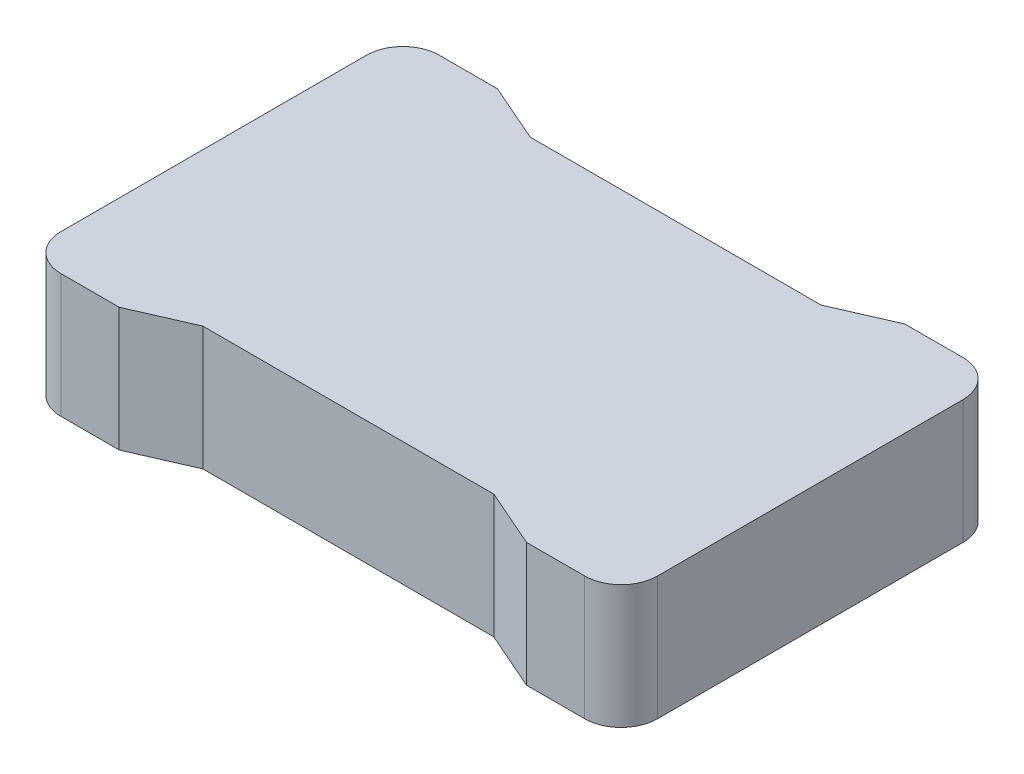
ISO-10303-21;
HEADER;
FILE_DESCRIPTION(('STEP AP214'),'2;1');
FILE_NAME('part.step','',(''),(''),'','','');
FILE_SCHEMA(('AUTOMOTIVE_DESIGN { 1 0 10303 214 1 1 1 1 }'));
ENDSEC;
DATA;
#1=APPLICATION_CONTEXT('core data for automotive mechanical design processes');
#2=APPLICATION_PROTOCOL_DEFINITION('international standard','automotive_design',2000,#1);
#3=PRODUCT_CONTEXT('',#1,'mechanical');
#4=PRODUCT('Part','Part','',(#3));
#5=PRODUCT_RELATED_PRODUCT_CATEGORY('part','',(#4));
#6=PRODUCT_DEFINITION_FORMATION('','',#4);
#7=PRODUCT_DEFINITION_CONTEXT('part definition',#1,'design');
#8=PRODUCT_DEFINITION('design','',#6,#7);
#9=PRODUCT_DEFINITION_SHAPE('','',#8);
#10=(LENGTH_UNIT() NAMED_UNIT(*) SI_UNIT(.MILLI.,.METRE.));
#11=(NAMED_UNIT(*) PLANE_ANGLE_UNIT() SI_UNIT($,.RADIAN.));
#12=(NAMED_UNIT(*) SI_UNIT($,.STERADIAN.) SOLID_ANGLE_UNIT());
#13=UNCERTAINTY_MEASURE_WITH_UNIT(LENGTH_MEASURE(1.E-05),#10,'distance_accuracy_value','');
#14=(GEOMETRIC_REPRESENTATION_CONTEXT(3) GLOBAL_UNCERTAINTY_ASSIGNED_CONTEXT((#13)) GLOBAL_UNIT_ASSIGNED_CONTEXT((#10,
#11,#12)) REPRESENTATION_CONTEXT('',''));
#15=CARTESIAN_POINT('',(0.,0.,0.));
#16=DIRECTION('',(0.,0.,1.));
#17=DIRECTION('',(1.,0.,0.));
#18=AXIS2_PLACEMENT_3D('',#15,#16,#17);
#19=CARTESIAN_POINT('',(20.,17.,-22.5));
#20=DIRECTION('',(0.400818834019709,0.,0.916157334902189));
#21=DIRECTION('',(0.916157334902188,0.,-0.400818834019709));
#22=AXIS2_PLACEMENT_3D('',#19,#20,#21);
#23=PLANE('',#22);
#24=DIRECTION('',(-0.916157334902188,0.,0.400818834019709));
#25=VECTOR('',#24,1.);
#26=CARTESIAN_POINT('',(20.,0.,-22.5));
#27=LINE('',#26,#25);
#28=CARTESIAN_POINT('',(28.,0.,-26.));
#29=VERTEX_POINT('',#28);
#30=CARTESIAN_POINT('',(20.,0.,-22.5));
#31=VERTEX_POINT('',#30);
#32=EDGE_CURVE('E200',#29,#31,#27,.T.);
#33=ORIENTED_EDGE('',*,*,#32,.T.);
#34=DIRECTION('',(0.,-1.,0.));
#35=VECTOR('',#34,1.);
#36=CARTESIAN_POINT('',(20.,17.,-22.5));
#37=LINE('',#36,#35);
#38=CARTESIAN_POINT('',(20.,17.,-22.5));
#39=VERTEX_POINT('',#38);
#40=EDGE_CURVE('E11',#39,#31,#37,.T.);
#41=ORIENTED_EDGE('',*,*,#40,.F.);
#42=DIRECTION('',(-0.916157334902188,0.,0.400818834019709));
#43=VECTOR('',#42,1.);
#44=CARTESIAN_POINT('',(20.,17.,-22.5));
#45=LINE('',#44,#43);
#46=CARTESIAN_POINT('',(28.,17.,-26.));
#47=VERTEX_POINT('',#46);
#48=EDGE_CURVE('E248',#47,#39,#45,.T.);
#49=ORIENTED_EDGE('',*,*,#48,.F.);
#50=DIRECTION('',(0.,-1.,0.));
#51=VECTOR('',#50,1.);
#52=CARTESIAN_POINT('',(28.,17.,-26.));
#53=LINE('',#52,#51);
#54=EDGE_CURVE('E196',#47,#29,#53,.T.);
#55=ORIENTED_EDGE('',*,*,#54,.T.);
#56=EDGE_LOOP('',(#33,#41,#49,#55));
#57=FACE_BOUND('',#56,.T.);
#58=ADVANCED_FACE('F39',(#57),#23,.F.);
#59=CARTESIAN_POINT('',(-20.,17.,-22.5));
#60=DIRECTION('',(0.,0.,1.));
#61=DIRECTION('',(1.,0.,0.));
#62=AXIS2_PLACEMENT_3D('',#59,#60,#61);
#63=PLANE('',#62);
#64=DIRECTION('',(1.,0.,0.));
#65=VECTOR('',#64,1.);
#66=CARTESIAN_POINT('',(-14.85,10.4,-22.5));
#67=LINE('',#66,#65);
#68=CARTESIAN_POINT('',(-14.85,10.4,-22.5));
#69=VERTEX_POINT('',#68);
#70=CARTESIAN_POINT('',(-10.15,10.4,-22.5));
#71=VERTEX_POINT('',#70);
#72=EDGE_CURVE('E389',#69,#71,#67,.T.);
#73=ORIENTED_EDGE('',*,*,#72,.F.);
#74=CARTESIAN_POINT('',(-14.85,8.5,-22.5));
#75=DIRECTION('',(0.,0.,-1.));
#76=DIRECTION('',(-1.,0.,0.));
#77=AXIS2_PLACEMENT_3D('',#74,#75,#76);
#78=CIRCLE('',#77,1.9);
#79=CARTESIAN_POINT('',(-14.85,6.6,-22.5));
#80=VERTEX_POINT('',#79);
#81=EDGE_CURVE('E54',#80,#69,#78,.T.);
#82=ORIENTED_EDGE('',*,*,#81,.F.);
#83=DIRECTION('',(-1.,0.,0.));
#84=VECTOR('',#83,1.);
#85=CARTESIAN_POINT('',(-14.85,6.6,-22.5));
#86=LINE('',#85,#84);
#87=CARTESIAN_POINT('',(-10.15,6.6,-22.5));
#88=VERTEX_POINT('',#87);
#89=EDGE_CURVE('E380',#88,#80,#86,.T.);
#90=ORIENTED_EDGE('',*,*,#89,.F.);
#91=CARTESIAN_POINT('',(-10.15,8.5,-22.5));
#92=DIRECTION('',(0.,0.,-1.));
#93=DIRECTION('',(-1.,0.,0.));
#94=AXIS2_PLACEMENT_3D('',#91,#92,#93);
#95=CIRCLE('',#94,1.9);
#96=EDGE_CURVE('E385',#71,#88,#95,.T.);
#97=ORIENTED_EDGE('',*,*,#96,.F.);
#98=EDGE_LOOP('',(#73,#82,#90,#97));
#99=FACE_BOUND('',#98,.T.);
#100=DIRECTION('',(-1.,0.,0.));
#101=VECTOR('',#100,1.);
#102=CARTESIAN_POINT('',(-20.,0.,-22.5));
#103=LINE('',#102,#101);
#104=CARTESIAN_POINT('',(-20.,0.,-22.5));
#105=VERTEX_POINT('',#104);
#106=EDGE_CURVE('E204',#31,#105,#103,.T.);
#107=ORIENTED_EDGE('',*,*,#106,.T.);
#108=DIRECTION('',(0.,-1.,0.));
#109=VECTOR('',#108,1.);
#110=CARTESIAN_POINT('',(-20.,17.,-22.5));
#111=LINE('',#110,#109);
#112=CARTESIAN_POINT('',(-20.,17.,-22.5));
#113=VERTEX_POINT('',#112);
#114=EDGE_CURVE('E47',#113,#105,#111,.T.);
#115=ORIENTED_EDGE('',*,*,#114,.F.);
#116=DIRECTION('',(-1.,0.,0.));
#117=VECTOR('',#116,1.);
#118=CARTESIAN_POINT('',(-20.,17.,-22.5));
#119=LINE('',#118,#117);
#120=EDGE_CURVE('E128',#39,#113,#119,.T.);
#121=ORIENTED_EDGE('',*,*,#120,.F.);
#122=ORIENTED_EDGE('',*,*,#40,.T.);
#123=EDGE_LOOP('',(#107,#115,#121,#122));
#124=FACE_BOUND('',#123,.T.);
#125=ADVANCED_FACE('F436',(#99,#124),#63,.F.);
#126=CARTESIAN_POINT('',(-28.,17.,-26.));
#127=DIRECTION('',(-0.400818834019709,0.,0.916157334902189));
#128=DIRECTION('',(0.916157334902189,0.,0.400818834019709));
#129=AXIS2_PLACEMENT_3D('',#126,#127,#128);
#130=PLANE('',#129);
#131=DIRECTION('',(-0.916157334902189,0.,-0.400818834019709));
#132=VECTOR('',#131,1.);
#133=CARTESIAN_POINT('',(-28.,0.,-26.));
#134=LINE('',#133,#132);
#135=CARTESIAN_POINT('',(-28.,0.,-26.));
#136=VERTEX_POINT('',#135);
#137=EDGE_CURVE('E208',#105,#136,#134,.T.);
#138=ORIENTED_EDGE('',*,*,#137,.T.);
#139=DIRECTION('',(0.,-1.,0.));
#140=VECTOR('',#139,1.);
#141=CARTESIAN_POINT('',(-28.,17.,-26.));
#142=LINE('',#141,#140);
#143=CARTESIAN_POINT('',(-28.,17.,-26.));
#144=VERTEX_POINT('',#143);
#145=EDGE_CURVE('E291',#144,#136,#142,.T.);
#146=ORIENTED_EDGE('',*,*,#145,.F.);
#147=DIRECTION('',(-0.916157334902189,0.,-0.400818834019709));
#148=VECTOR('',#147,1.);
#149=CARTESIAN_POINT('',(-28.,17.,-26.));
#150=LINE('',#149,#148);
#151=EDGE_CURVE('E301',#113,#144,#150,.T.);
#152=ORIENTED_EDGE('',*,*,#151,.F.);
#153=ORIENTED_EDGE('',*,*,#114,.T.);
#154=EDGE_LOOP('',(#138,#146,#152,#153));
#155=FACE_BOUND('',#154,.T.);
#156=ADVANCED_FACE('F299',(#155),#130,.F.);
#157=CARTESIAN_POINT('',(-36.,17.,-26.));
#158=DIRECTION('',(0.,0.,1.));
#159=DIRECTION('',(1.,0.,0.));
#160=AXIS2_PLACEMENT_3D('',#157,#158,#159);
#161=PLANE('',#160);
#162=DIRECTION('',(-1.,0.,0.));
#163=VECTOR('',#162,1.);
#164=CARTESIAN_POINT('',(-36.,0.,-26.));
#165=LINE('',#164,#163);
#166=CARTESIAN_POINT('',(-36.,0.,-26.));
#167=VERTEX_POINT('',#166);
#168=EDGE_CURVE('E211',#136,#167,#165,.T.);
#169=ORIENTED_EDGE('',*,*,#168,.T.);
#170=DIRECTION('',(0.,-1.,0.));
#171=VECTOR('',#170,1.);
#172=CARTESIAN_POINT('',(-36.,17.,-26.));
#173=LINE('',#172,#171);
#174=CARTESIAN_POINT('',(-36.,17.,-26.));
#175=VERTEX_POINT('',#174);
#176=EDGE_CURVE('E287',#175,#167,#173,.T.);
#177=ORIENTED_EDGE('',*,*,#176,.F.);
#178=DIRECTION('',(-1.,0.,0.));
#179=VECTOR('',#178,1.);
#180=CARTESIAN_POINT('',(-36.,17.,-26.));
#181=LINE('',#180,#179);
#182=EDGE_CURVE('E320',#144,#175,#181,.T.);
#183=ORIENTED_EDGE('',*,*,#182,.F.);
#184=ORIENTED_EDGE('',*,*,#145,.T.);
#185=EDGE_LOOP('',(#169,#177,#183,#184));
#186=FACE_BOUND('',#185,.T.);
#187=ADVANCED_FACE('F310',(#186),#161,.F.);
#188=CARTESIAN_POINT('',(-36.,17.,-21.));
#189=DIRECTION('',(0.,-1.,0.));
#190=DIRECTION('',(0.,0.,-1.));
#191=AXIS2_PLACEMENT_3D('',#188,#189,#190);
#192=CYLINDRICAL_SURFACE('',#191,5.);
#193=CARTESIAN_POINT('',(-36.,0.,-21.));
#194=DIRECTION('',(0.,1.,0.));
#195=DIRECTION('',(0.,0.,-1.));
#196=AXIS2_PLACEMENT_3D('',#193,#194,#195);
#197=CIRCLE('',#196,5.);
#198=CARTESIAN_POINT('',(-41.,0.,-21.));
#199=VERTEX_POINT('',#198);
#200=EDGE_CURVE('E214',#167,#199,#197,.T.);
#201=ORIENTED_EDGE('',*,*,#200,.T.);
#202=DIRECTION('',(0.,-1.,0.));
#203=VECTOR('',#202,1.);
#204=CARTESIAN_POINT('',(-41.,17.,-21.));
#205=LINE('',#204,#203);
#206=CARTESIAN_POINT('',(-41.,17.,-21.));
#207=VERTEX_POINT('',#206);
#208=EDGE_CURVE('E283',#207,#199,#205,.T.);
#209=ORIENTED_EDGE('',*,*,#208,.F.);
#210=CARTESIAN_POINT('',(-36.,17.,-21.));
#211=DIRECTION('',(0.,1.,0.));
#212=DIRECTION('',(0.,0.,-1.));
#213=AXIS2_PLACEMENT_3D('',#210,#211,#212);
#214=CIRCLE('',#213,5.);
#215=EDGE_CURVE('E316',#175,#207,#214,.T.);
#216=ORIENTED_EDGE('',*,*,#215,.F.);
#217=ORIENTED_EDGE('',*,*,#176,.T.);
#218=EDGE_LOOP('',(#201,#209,#216,#217));
#219=FACE_BOUND('',#218,.T.);
#220=ADVANCED_FACE('F314',(#219),#192,.T.);
#221=CARTESIAN_POINT('',(-41.,17.,21.));
#222=DIRECTION('',(1.,0.,0.));
#223=DIRECTION('',(0.,0.,-1.));
#224=AXIS2_PLACEMENT_3D('',#221,#222,#223);
#225=PLANE('',#224);
#226=DIRECTION('',(0.,0.,1.));
#227=VECTOR('',#226,1.);
#228=CARTESIAN_POINT('',(-41.,0.,21.));
#229=LINE('',#228,#227);
#230=CARTESIAN_POINT('',(-41.,0.,21.));
#231=VERTEX_POINT('',#230);
#232=EDGE_CURVE('E217',#199,#231,#229,.T.);
#233=ORIENTED_EDGE('',*,*,#232,.T.);
#234=DIRECTION('',(0.,-1.,0.));
#235=VECTOR('',#234,1.);
#236=CARTESIAN_POINT('',(-41.,17.,21.));
#237=LINE('',#236,#235);
#238=CARTESIAN_POINT('',(-41.,17.,21.));
#239=VERTEX_POINT('',#238);
#240=EDGE_CURVE('E279',#239,#231,#237,.T.);
#241=ORIENTED_EDGE('',*,*,#240,.F.);
#242=DIRECTION('',(0.,0.,1.));
#243=VECTOR('',#242,1.);
#244=CARTESIAN_POINT('',(-41.,17.,21.));
#245=LINE('',#244,#243);
#246=EDGE_CURVE('E319',#207,#239,#245,.T.);
#247=ORIENTED_EDGE('',*,*,#246,.F.);
#248=ORIENTED_EDGE('',*,*,#208,.T.);
#249=EDGE_LOOP('',(#233,#241,#247,#248));
#250=FACE_BOUND('',#249,.T.);
#251=ADVANCED_FACE('F461',(#250),#225,.F.);
#252=CARTESIAN_POINT('',(-36.,17.,21.));
#253=DIRECTION('',(0.,-1.,0.));
#254=DIRECTION('',(0.,0.,-1.));
#255=AXIS2_PLACEMENT_3D('',#252,#253,#254);
#256=CYLINDRICAL_SURFACE('',#255,5.);
#257=CARTESIAN_POINT('',(-36.,0.,21.));
#258=DIRECTION('',(0.,1.,0.));
#259=DIRECTION('',(0.,0.,-1.));
#260=AXIS2_PLACEMENT_3D('',#257,#258,#259);
#261=CIRCLE('',#260,5.);
#262=CARTESIAN_POINT('',(-36.,0.,26.));
#263=VERTEX_POINT('',#262);
#264=EDGE_CURVE('E220',#231,#263,#261,.T.);
#265=ORIENTED_EDGE('',*,*,#264,.T.);
#266=DIRECTION('',(0.,-1.,0.));
#267=VECTOR('',#266,1.);
#268=CARTESIAN_POINT('',(-36.,17.,26.));
#269=LINE('',#268,#267);
#270=CARTESIAN_POINT('',(-36.,17.,26.));
#271=VERTEX_POINT('',#270);
#272=EDGE_CURVE('E275',#271,#263,#269,.T.);
#273=ORIENTED_EDGE('',*,*,#272,.F.);
#274=CARTESIAN_POINT('',(-36.,17.,21.));
#275=DIRECTION('',(0.,1.,0.));
#276=DIRECTION('',(0.,0.,-1.));
#277=AXIS2_PLACEMENT_3D('',#274,#275,#276);
#278=CIRCLE('',#277,5.);
#279=EDGE_CURVE('E324',#239,#271,#278,.T.);
#280=ORIENTED_EDGE('',*,*,#279,.F.);
#281=ORIENTED_EDGE('',*,*,#240,.T.);
#282=EDGE_LOOP('',(#265,#273,#280,#281));
#283=FACE_BOUND('',#282,.T.);
#284=ADVANCED_FACE('F464',(#283),#256,.T.);
#285=CARTESIAN_POINT('',(-36.,17.,26.));
#286=DIRECTION('',(0.,0.,-1.));
#287=DIRECTION('',(-1.,0.,0.));
#288=AXIS2_PLACEMENT_3D('',#285,#286,#287);
#289=PLANE('',#288);
#290=DIRECTION('',(1.,0.,0.));
#291=VECTOR('',#290,1.);
#292=CARTESIAN_POINT('',(-36.,0.,26.));
#293=LINE('',#292,#291);
#294=CARTESIAN_POINT('',(-28.,0.,26.));
#295=VERTEX_POINT('',#294);
#296=EDGE_CURVE('E223',#263,#295,#293,.T.);
#297=ORIENTED_EDGE('',*,*,#296,.T.);
#298=DIRECTION('',(0.,-1.,0.));
#299=VECTOR('',#298,1.);
#300=CARTESIAN_POINT('',(-28.,17.,26.));
#301=LINE('',#300,#299);
#302=CARTESIAN_POINT('',(-28.,17.,26.));
#303=VERTEX_POINT('',#302);
#304=EDGE_CURVE('E271',#303,#295,#301,.T.);
#305=ORIENTED_EDGE('',*,*,#304,.F.);
#306=DIRECTION('',(1.,0.,0.));
#307=VECTOR('',#306,1.);
#308=CARTESIAN_POINT('',(-36.,17.,26.));
#309=LINE('',#308,#307);
#310=EDGE_CURVE('E331',#271,#303,#309,.T.);
#311=ORIENTED_EDGE('',*,*,#310,.F.);
#312=ORIENTED_EDGE('',*,*,#272,.T.);
#313=EDGE_LOOP('',(#297,#305,#311,#312));
#314=FACE_BOUND('',#313,.T.);
#315=ADVANCED_FACE('F468',(#314),#289,.F.);
#316=CARTESIAN_POINT('',(-20.,17.,22.5));
#317=DIRECTION('',(-0.400818834019706,0.,-0.91615733490219));
#318=DIRECTION('',(-0.91615733490219,0.,0.400818834019706));
#319=AXIS2_PLACEMENT_3D('',#316,#317,#318);
#320=PLANE('',#319);
#321=DIRECTION('',(0.91615733490219,0.,-0.400818834019706));
#322=VECTOR('',#321,1.);
#323=CARTESIAN_POINT('',(-20.,0.,22.5));
#324=LINE('',#323,#322);
#325=CARTESIAN_POINT('',(-20.,0.,22.5));
#326=VERTEX_POINT('',#325);
#327=EDGE_CURVE('E226',#295,#326,#324,.T.);
#328=ORIENTED_EDGE('',*,*,#327,.T.);
#329=DIRECTION('',(0.,-1.,0.));
#330=VECTOR('',#329,1.);
#331=CARTESIAN_POINT('',(-20.,17.,22.5));
#332=LINE('',#331,#330);
#333=CARTESIAN_POINT('',(-20.,17.,22.5));
#334=VERTEX_POINT('',#333);
#335=EDGE_CURVE('E267',#334,#326,#332,.T.);
#336=ORIENTED_EDGE('',*,*,#335,.F.);
#337=DIRECTION('',(0.91615733490219,0.,-0.400818834019706));
#338=VECTOR('',#337,1.);
#339=CARTESIAN_POINT('',(-20.,17.,22.5));
#340=LINE('',#339,#338);
#341=EDGE_CURVE('E334',#303,#334,#340,.T.);
#342=ORIENTED_EDGE('',*,*,#341,.F.);
#343=ORIENTED_EDGE('',*,*,#304,.T.);
#344=EDGE_LOOP('',(#328,#336,#342,#343));
#345=FACE_BOUND('',#344,.T.);
#346=ADVANCED_FACE('F472',(#345),#320,.F.);
#347=CARTESIAN_POINT('',(-20.,17.,22.5));
#348=DIRECTION('',(0.,0.,-1.));
#349=DIRECTION('',(-1.,0.,0.));
#350=AXIS2_PLACEMENT_3D('',#347,#348,#349);
#351=PLANE('',#350);
#352=DIRECTION('',(1.,0.,0.));
#353=VECTOR('',#352,1.);
#354=CARTESIAN_POINT('',(-20.,0.,22.5));
#355=LINE('',#354,#353);
#356=CARTESIAN_POINT('',(20.,0.,22.5));
#357=VERTEX_POINT('',#356);
#358=EDGE_CURVE('E229',#326,#357,#355,.T.);
#359=ORIENTED_EDGE('',*,*,#358,.T.);
#360=DIRECTION('',(0.,-1.,0.));
#361=VECTOR('',#360,1.);
#362=CARTESIAN_POINT('',(20.,17.,22.5));
#363=LINE('',#362,#361);
#364=CARTESIAN_POINT('',(20.,17.,22.5));
#365=VERTEX_POINT('',#364);
#366=EDGE_CURVE('E263',#365,#357,#363,.T.);
#367=ORIENTED_EDGE('',*,*,#366,.F.);
#368=DIRECTION('',(1.,0.,0.));
#369=VECTOR('',#368,1.);
#370=CARTESIAN_POINT('',(-20.,17.,22.5));
#371=LINE('',#370,#369);
#372=EDGE_CURVE('E337',#334,#365,#371,.T.);
#373=ORIENTED_EDGE('',*,*,#372,.F.);
#374=ORIENTED_EDGE('',*,*,#335,.T.);
#375=EDGE_LOOP('',(#359,#367,#373,#374));
#376=FACE_BOUND('',#375,.T.);
#377=ADVANCED_FACE('F476',(#376),#351,.F.);
#378=CARTESIAN_POINT('',(28.,17.,26.));
#379=DIRECTION('',(0.400818834019706,0.,-0.91615733490219));
#380=DIRECTION('',(-0.91615733490219,0.,-0.400818834019706));
#381=AXIS2_PLACEMENT_3D('',#378,#379,#380);
#382=PLANE('',#381);
#383=DIRECTION('',(0.91615733490219,0.,0.400818834019706));
#384=VECTOR('',#383,1.);
#385=CARTESIAN_POINT('',(28.,0.,26.));
#386=LINE('',#385,#384);
#387=CARTESIAN_POINT('',(28.,0.,26.));
#388=VERTEX_POINT('',#387);
#389=EDGE_CURVE('E232',#357,#388,#386,.T.);
#390=ORIENTED_EDGE('',*,*,#389,.T.);
#391=DIRECTION('',(0.,-1.,0.));
#392=VECTOR('',#391,1.);
#393=CARTESIAN_POINT('',(28.,17.,26.));
#394=LINE('',#393,#392);
#395=CARTESIAN_POINT('',(28.,17.,26.));
#396=VERTEX_POINT('',#395);
#397=EDGE_CURVE('E259',#396,#388,#394,.T.);
#398=ORIENTED_EDGE('',*,*,#397,.F.);
#399=DIRECTION('',(0.91615733490219,0.,0.400818834019706));
#400=VECTOR('',#399,1.);
#401=CARTESIAN_POINT('',(28.,17.,26.));
#402=LINE('',#401,#400);
#403=EDGE_CURVE('E340',#365,#396,#402,.T.);
#404=ORIENTED_EDGE('',*,*,#403,.F.);
#405=ORIENTED_EDGE('',*,*,#366,.T.);
#406=EDGE_LOOP('',(#390,#398,#404,#405));
#407=FACE_BOUND('',#406,.T.);
#408=ADVANCED_FACE('F480',(#407),#382,.F.);
#409=CARTESIAN_POINT('',(28.,17.,26.));
#410=DIRECTION('',(0.,0.,-1.));
#411=DIRECTION('',(-1.,0.,0.));
#412=AXIS2_PLACEMENT_3D('',#409,#410,#411);
#413=PLANE('',#412);
#414=DIRECTION('',(1.,0.,0.));
#415=VECTOR('',#414,1.);
#416=CARTESIAN_POINT('',(28.,0.,26.));
#417=LINE('',#416,#415);
#418=CARTESIAN_POINT('',(36.,0.,26.));
#419=VERTEX_POINT('',#418);
#420=EDGE_CURVE('E235',#388,#419,#417,.T.);
#421=ORIENTED_EDGE('',*,*,#420,.T.);
#422=DIRECTION('',(0.,-1.,0.));
#423=VECTOR('',#422,1.);
#424=CARTESIAN_POINT('',(36.,17.,26.));
#425=LINE('',#424,#423);
#426=CARTESIAN_POINT('',(36.,17.,26.));
#427=VERTEX_POINT('',#426);
#428=EDGE_CURVE('E255',#427,#419,#425,.T.);
#429=ORIENTED_EDGE('',*,*,#428,.F.);
#430=DIRECTION('',(1.,0.,0.));
#431=VECTOR('',#430,1.);
#432=CARTESIAN_POINT('',(28.,17.,26.));
#433=LINE('',#432,#431);
#434=EDGE_CURVE('E343',#396,#427,#433,.T.);
#435=ORIENTED_EDGE('',*,*,#434,.F.);
#436=ORIENTED_EDGE('',*,*,#397,.T.);
#437=EDGE_LOOP('',(#421,#429,#435,#436));
#438=FACE_BOUND('',#437,.T.);
#439=ADVANCED_FACE('F351',(#438),#413,.F.);
#440=CARTESIAN_POINT('',(36.,17.,21.));
#441=DIRECTION('',(0.,-1.,0.));
#442=DIRECTION('',(0.,0.,-1.));
#443=AXIS2_PLACEMENT_3D('',#440,#441,#442);
#444=CYLINDRICAL_SURFACE('',#443,5.);
#445=CARTESIAN_POINT('',(36.,0.,21.));
#446=DIRECTION('',(0.,1.,0.));
#447=DIRECTION('',(0.,0.,1.));
#448=AXIS2_PLACEMENT_3D('',#445,#446,#447);
#449=CIRCLE('',#448,5.);
#450=CARTESIAN_POINT('',(41.,0.,21.));
#451=VERTEX_POINT('',#450);
#452=EDGE_CURVE('E238',#419,#451,#449,.T.);
#453=ORIENTED_EDGE('',*,*,#452,.T.);
#454=DIRECTION('',(0.,-1.,0.));
#455=VECTOR('',#454,1.);
#456=CARTESIAN_POINT('',(41.,17.,21.));
#457=LINE('',#456,#455);
#458=CARTESIAN_POINT('',(41.,17.,21.));
#459=VERTEX_POINT('',#458);
#460=EDGE_CURVE('E189',#459,#451,#457,.T.);
#461=ORIENTED_EDGE('',*,*,#460,.F.);
#462=CARTESIAN_POINT('',(36.,17.,21.));
#463=DIRECTION('',(0.,1.,0.));
#464=DIRECTION('',(0.,0.,1.));
#465=AXIS2_PLACEMENT_3D('',#462,#463,#464);
#466=CIRCLE('',#465,5.);
#467=EDGE_CURVE('E175',#427,#459,#466,.T.);
#468=ORIENTED_EDGE('',*,*,#467,.F.);
#469=ORIENTED_EDGE('',*,*,#428,.T.);
#470=EDGE_LOOP('',(#453,#461,#468,#469));
#471=FACE_BOUND('',#470,.T.);
#472=ADVANCED_FACE('F355',(#471),#444,.T.);
#473=CARTESIAN_POINT('',(41.,17.,21.));
#474=DIRECTION('',(-1.,0.,0.));
#475=DIRECTION('',(0.,0.,1.));
#476=AXIS2_PLACEMENT_3D('',#473,#474,#475);
#477=PLANE('',#476);
#478=DIRECTION('',(0.,0.,-1.));
#479=VECTOR('',#478,1.);
#480=CARTESIAN_POINT('',(41.,0.,21.));
#481=LINE('',#480,#479);
#482=CARTESIAN_POINT('',(41.,0.,-21.));
#483=VERTEX_POINT('',#482);
#484=EDGE_CURVE('E185',#451,#483,#481,.T.);
#485=ORIENTED_EDGE('',*,*,#484,.T.);
#486=DIRECTION('',(0.,-1.,0.));
#487=VECTOR('',#486,1.);
#488=CARTESIAN_POINT('',(41.,17.,-21.));
#489=LINE('',#488,#487);
#490=CARTESIAN_POINT('',(41.,17.,-21.));
#491=VERTEX_POINT('',#490);
#492=EDGE_CURVE('E182',#491,#483,#489,.T.);
#493=ORIENTED_EDGE('',*,*,#492,.F.);
#494=DIRECTION('',(0.,0.,-1.));
#495=VECTOR('',#494,1.);
#496=CARTESIAN_POINT('',(41.,17.,21.));
#497=LINE('',#496,#495);
#498=EDGE_CURVE('E168',#459,#491,#497,.T.);
#499=ORIENTED_EDGE('',*,*,#498,.F.);
#500=ORIENTED_EDGE('',*,*,#460,.T.);
#501=EDGE_LOOP('',(#485,#493,#499,#500));
#502=FACE_BOUND('',#501,.T.);
#503=ADVANCED_FACE('F183',(#502),#477,.F.);
#504=CARTESIAN_POINT('',(36.,17.,-21.));
#505=DIRECTION('',(0.,-1.,0.));
#506=DIRECTION('',(0.,0.,-1.));
#507=AXIS2_PLACEMENT_3D('',#504,#505,#506);
#508=CYLINDRICAL_SURFACE('',#507,5.);
#509=CARTESIAN_POINT('',(36.,0.,-21.));
#510=DIRECTION('',(0.,1.,0.));
#511=DIRECTION('',(0.,0.,-1.));
#512=AXIS2_PLACEMENT_3D('',#509,#510,#511);
#513=CIRCLE('',#512,5.);
#514=CARTESIAN_POINT('',(36.,0.,-26.));
#515=VERTEX_POINT('',#514);
#516=EDGE_CURVE('E243',#483,#515,#513,.T.);
#517=ORIENTED_EDGE('',*,*,#516,.T.);
#518=DIRECTION('',(0.,-1.,0.));
#519=VECTOR('',#518,1.);
#520=CARTESIAN_POINT('',(36.,17.,-26.));
#521=LINE('',#520,#519);
#522=CARTESIAN_POINT('',(36.,17.,-26.));
#523=VERTEX_POINT('',#522);
#524=EDGE_CURVE('E190',#523,#515,#521,.T.);
#525=ORIENTED_EDGE('',*,*,#524,.F.);
#526=CARTESIAN_POINT('',(36.,17.,-21.));
#527=DIRECTION('',(0.,1.,0.));
#528=DIRECTION('',(0.,0.,-1.));
#529=AXIS2_PLACEMENT_3D('',#526,#527,#528);
#530=CIRCLE('',#529,5.);
#531=EDGE_CURVE('E172',#491,#523,#530,.T.);
#532=ORIENTED_EDGE('',*,*,#531,.F.);
#533=ORIENTED_EDGE('',*,*,#492,.T.);
#534=EDGE_LOOP('',(#517,#525,#532,#533));
#535=FACE_BOUND('',#534,.T.);
#536=ADVANCED_FACE('F192',(#535),#508,.T.);
#537=CARTESIAN_POINT('',(28.,17.,-26.));
#538=DIRECTION('',(0.,0.,1.));
#539=DIRECTION('',(1.,0.,0.));
#540=AXIS2_PLACEMENT_3D('',#537,#538,#539);
#541=PLANE('',#540);
#542=DIRECTION('',(-1.,0.,0.));
#543=VECTOR('',#542,1.);
#544=CARTESIAN_POINT('',(28.,0.,-26.));
#545=LINE('',#544,#543);
#546=EDGE_CURVE('E120',#515,#29,#545,.T.);
#547=ORIENTED_EDGE('',*,*,#546,.T.);
#548=ORIENTED_EDGE('',*,*,#54,.F.);
#549=DIRECTION('',(-1.,0.,0.));
#550=VECTOR('',#549,1.);
#551=CARTESIAN_POINT('',(28.,17.,-26.));
#552=LINE('',#551,#550);
#553=EDGE_CURVE('E63',#523,#47,#552,.T.);
#554=ORIENTED_EDGE('',*,*,#553,.F.);
#555=ORIENTED_EDGE('',*,*,#524,.T.);
#556=EDGE_LOOP('',(#547,#548,#554,#555));
#557=FACE_BOUND('',#556,.T.);
#558=ADVANCED_FACE('F356',(#557),#541,.F.);
#559=CARTESIAN_POINT('',(36.,17.,-21.));
#560=DIRECTION('',(0.,-1.,0.));
#561=DIRECTION('',(0.,0.,-1.));
#562=AXIS2_PLACEMENT_3D('',#559,#560,#561);
#563=PLANE('',#562);
#564=ORIENTED_EDGE('',*,*,#48,.T.);
#565=ORIENTED_EDGE('',*,*,#120,.T.);
#566=ORIENTED_EDGE('',*,*,#151,.T.);
#567=ORIENTED_EDGE('',*,*,#182,.T.);
#568=ORIENTED_EDGE('',*,*,#215,.T.);
#569=ORIENTED_EDGE('',*,*,#246,.T.);
#570=ORIENTED_EDGE('',*,*,#279,.T.);
#571=ORIENTED_EDGE('',*,*,#310,.T.);
#572=ORIENTED_EDGE('',*,*,#341,.T.);
#573=ORIENTED_EDGE('',*,*,#372,.T.);
#574=ORIENTED_EDGE('',*,*,#403,.T.);
#575=ORIENTED_EDGE('',*,*,#434,.T.);
#576=ORIENTED_EDGE('',*,*,#467,.T.);
#577=ORIENTED_EDGE('',*,*,#498,.T.);
#578=ORIENTED_EDGE('',*,*,#531,.T.);
#579=ORIENTED_EDGE('',*,*,#553,.T.);
#580=EDGE_LOOP('',(#564,#565,#566,#567,#568,#569,#570,#571,#572,#573,#574,#575,#576,#577,#578,#579));
#581=FACE_BOUND('',#580,.T.);
#582=ADVANCED_FACE('F170',(#581),#563,.F.);
#583=CARTESIAN_POINT('',(36.,0.,-21.));
#584=DIRECTION('',(0.,-1.,0.));
#585=DIRECTION('',(0.,0.,-1.));
#586=AXIS2_PLACEMENT_3D('',#583,#584,#585);
#587=PLANE('',#586);
#588=ORIENTED_EDGE('',*,*,#32,.F.);
#589=ORIENTED_EDGE('',*,*,#546,.F.);
#590=ORIENTED_EDGE('',*,*,#516,.F.);
#591=ORIENTED_EDGE('',*,*,#484,.F.);
#592=ORIENTED_EDGE('',*,*,#452,.F.);
#593=ORIENTED_EDGE('',*,*,#420,.F.);
#594=ORIENTED_EDGE('',*,*,#389,.F.);
#595=ORIENTED_EDGE('',*,*,#358,.F.);
#596=ORIENTED_EDGE('',*,*,#327,.F.);
#597=ORIENTED_EDGE('',*,*,#296,.F.);
#598=ORIENTED_EDGE('',*,*,#264,.F.);
#599=ORIENTED_EDGE('',*,*,#232,.F.);
#600=ORIENTED_EDGE('',*,*,#200,.F.);
#601=ORIENTED_EDGE('',*,*,#168,.F.);
#602=ORIENTED_EDGE('',*,*,#137,.F.);
#603=ORIENTED_EDGE('',*,*,#106,.F.);
#604=EDGE_LOOP('',(#588,#589,#590,#591,#592,#593,#594,#595,#596,#597,#598,#599,#600,#601,#602,#603));
#605=FACE_BOUND('',#604,.T.);
#606=ADVANCED_FACE('F305',(#605),#587,.T.);
#607=CARTESIAN_POINT('',(-14.85,8.5,-12.5));
#608=DIRECTION('',(0.,0.,-1.));
#609=DIRECTION('',(-1.,0.,0.));
#610=AXIS2_PLACEMENT_3D('',#607,#608,#609);
#611=CYLINDRICAL_SURFACE('',#610,1.9);
#612=ORIENTED_EDGE('',*,*,#81,.T.);
#613=DIRECTION('',(0.,0.,-1.));
#614=VECTOR('',#613,1.);
#615=CARTESIAN_POINT('',(-14.85,10.4,-12.5));
#616=LINE('',#615,#614);
#617=CARTESIAN_POINT('',(-14.85,10.4,-12.5));
#618=VERTEX_POINT('',#617);
#619=EDGE_CURVE('E365',#618,#69,#616,.T.);
#620=ORIENTED_EDGE('',*,*,#619,.F.);
#621=CARTESIAN_POINT('',(-14.85,8.5,-12.5));
#622=DIRECTION('',(0.,0.,-1.));
#623=DIRECTION('',(-1.,0.,0.));
#624=AXIS2_PLACEMENT_3D('',#621,#622,#623);
#625=CIRCLE('',#624,1.9);
#626=CARTESIAN_POINT('',(-14.85,6.6,-12.5));
#627=VERTEX_POINT('',#626);
#628=EDGE_CURVE('E384',#627,#618,#625,.T.);
#629=ORIENTED_EDGE('',*,*,#628,.F.);
#630=DIRECTION('',(0.,0.,-1.));
#631=VECTOR('',#630,1.);
#632=CARTESIAN_POINT('',(-14.85,6.6,-12.5));
#633=LINE('',#632,#631);
#634=EDGE_CURVE('E205',#627,#80,#633,.T.);
#635=ORIENTED_EDGE('',*,*,#634,.T.);
#636=EDGE_LOOP('',(#612,#620,#629,#635));
#637=FACE_BOUND('',#636,.T.);
#638=ADVANCED_FACE('F416',(#637),#611,.F.);
#639=CARTESIAN_POINT('',(-14.85,6.6,-12.5));
#640=DIRECTION('',(0.,-1.,0.));
#641=DIRECTION('',(1.,0.,0.));
#642=AXIS2_PLACEMENT_3D('',#639,#640,#641);
#643=PLANE('',#642);
#644=ORIENTED_EDGE('',*,*,#89,.T.);
#645=ORIENTED_EDGE('',*,*,#634,.F.);
#646=DIRECTION('',(-1.,0.,0.));
#647=VECTOR('',#646,1.);
#648=CARTESIAN_POINT('',(-14.85,6.6,-12.5));
#649=LINE('',#648,#647);
#650=CARTESIAN_POINT('',(-10.15,6.6,-12.5));
#651=VERTEX_POINT('',#650);
#652=EDGE_CURVE('E370',#651,#627,#649,.T.);
#653=ORIENTED_EDGE('',*,*,#652,.F.);
#654=DIRECTION('',(0.,0.,-1.));
#655=VECTOR('',#654,1.);
#656=CARTESIAN_POINT('',(-10.15,6.6,-12.5));
#657=LINE('',#656,#655);
#658=EDGE_CURVE('E374',#651,#88,#657,.T.);
#659=ORIENTED_EDGE('',*,*,#658,.T.);
#660=EDGE_LOOP('',(#644,#645,#653,#659));
#661=FACE_BOUND('',#660,.T.);
#662=ADVANCED_FACE('F427',(#661),#643,.F.);
#663=CARTESIAN_POINT('',(-10.15,8.5,-12.5));
#664=DIRECTION('',(0.,0.,-1.));
#665=DIRECTION('',(-1.,0.,0.));
#666=AXIS2_PLACEMENT_3D('',#663,#664,#665);
#667=CYLINDRICAL_SURFACE('',#666,1.9);
#668=ORIENTED_EDGE('',*,*,#96,.T.);
#669=ORIENTED_EDGE('',*,*,#658,.F.);
#670=CARTESIAN_POINT('',(-10.15,8.5,-12.5));
#671=DIRECTION('',(0.,0.,-1.));
#672=DIRECTION('',(-1.,0.,0.));
#673=AXIS2_PLACEMENT_3D('',#670,#671,#672);
#674=CIRCLE('',#673,1.9);
#675=CARTESIAN_POINT('',(-10.15,10.4,-12.5));
#676=VERTEX_POINT('',#675);
#677=EDGE_CURVE('E398',#676,#651,#674,.T.);
#678=ORIENTED_EDGE('',*,*,#677,.F.);
#679=DIRECTION('',(0.,0.,-1.));
#680=VECTOR('',#679,1.);
#681=CARTESIAN_POINT('',(-10.15,10.4,-12.5));
#682=LINE('',#681,#680);
#683=EDGE_CURVE('E369',#676,#71,#682,.T.);
#684=ORIENTED_EDGE('',*,*,#683,.T.);
#685=EDGE_LOOP('',(#668,#669,#678,#684));
#686=FACE_BOUND('',#685,.T.);
#687=ADVANCED_FACE('F432',(#686),#667,.F.);
#688=CARTESIAN_POINT('',(-14.85,10.4,-12.5));
#689=DIRECTION('',(0.,1.,0.));
#690=DIRECTION('',(-1.,0.,0.));
#691=AXIS2_PLACEMENT_3D('',#688,#689,#690);
#692=PLANE('',#691);
#693=ORIENTED_EDGE('',*,*,#72,.T.);
#694=ORIENTED_EDGE('',*,*,#683,.F.);
#695=DIRECTION('',(1.,0.,0.));
#696=VECTOR('',#695,1.);
#697=CARTESIAN_POINT('',(-14.85,10.4,-12.5));
#698=LINE('',#697,#696);
#699=EDGE_CURVE('E402',#618,#676,#698,.T.);
#700=ORIENTED_EDGE('',*,*,#699,.F.);
#701=ORIENTED_EDGE('',*,*,#619,.T.);
#702=EDGE_LOOP('',(#693,#694,#700,#701));
#703=FACE_BOUND('',#702,.T.);
#704=ADVANCED_FACE('F438',(#703),#692,.F.);
#705=CARTESIAN_POINT('',(-14.85,8.5,-12.5));
#706=DIRECTION('',(0.,0.,-1.));
#707=DIRECTION('',(-1.,0.,0.));
#708=AXIS2_PLACEMENT_3D('',#705,#706,#707);
#709=PLANE('',#708);
#710=ORIENTED_EDGE('',*,*,#628,.T.);
#711=ORIENTED_EDGE('',*,*,#699,.T.);
#712=ORIENTED_EDGE('',*,*,#677,.T.);
#713=ORIENTED_EDGE('',*,*,#652,.T.);
#714=EDGE_LOOP('',(#710,#711,#712,#713));
#715=FACE_BOUND('',#714,.T.);
#716=ADVANCED_FACE('F411',(#715),#709,.T.);
#717=CLOSED_SHELL('',(#58,#125,#156,#187,#220,#251,#284,#315,#346,#377,#408,#439,#472,#503,#536,
#558,#582,#606,#638,#662,#687,#704,#716));
#718=MANIFOLD_SOLID_BREP('B2',#717);
#719=ADVANCED_BREP_SHAPE_REPRESENTATION('',(#18,#718),#14);
#720=SHAPE_DEFINITION_REPRESENTATION(#9,#719);
ENDSEC;
END-ISO-10303-21;
